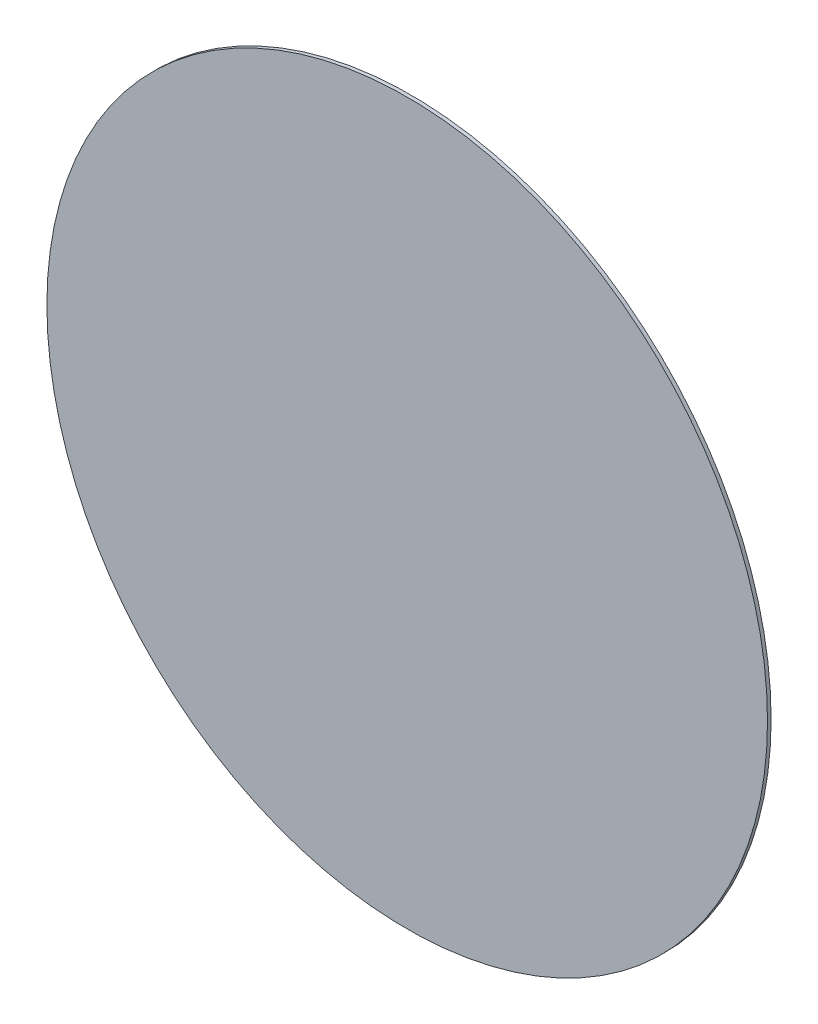
ISO-10303-21;
HEADER;
FILE_DESCRIPTION(('STEP AP214'),'2;1');
FILE_NAME('part.step','',(''),(''),'','','');
FILE_SCHEMA(('AUTOMOTIVE_DESIGN { 1 0 10303 214 1 1 1 1 }'));
ENDSEC;
DATA;
#1=APPLICATION_CONTEXT('core data for automotive mechanical design processes');
#2=APPLICATION_PROTOCOL_DEFINITION('international standard','automotive_design',2000,#1);
#3=PRODUCT_CONTEXT('',#1,'mechanical');
#4=PRODUCT('Part','Part','',(#3));
#5=PRODUCT_RELATED_PRODUCT_CATEGORY('part','',(#4));
#6=PRODUCT_DEFINITION_FORMATION('','',#4);
#7=PRODUCT_DEFINITION_CONTEXT('part definition',#1,'design');
#8=PRODUCT_DEFINITION('design','',#6,#7);
#9=PRODUCT_DEFINITION_SHAPE('','',#8);
#10=(LENGTH_UNIT() NAMED_UNIT(*) SI_UNIT(.MILLI.,.METRE.));
#11=(NAMED_UNIT(*) PLANE_ANGLE_UNIT() SI_UNIT($,.RADIAN.));
#12=(NAMED_UNIT(*) SI_UNIT($,.STERADIAN.) SOLID_ANGLE_UNIT());
#13=UNCERTAINTY_MEASURE_WITH_UNIT(LENGTH_MEASURE(1.E-05),#10,'distance_accuracy_value','');
#14=(GEOMETRIC_REPRESENTATION_CONTEXT(3) GLOBAL_UNCERTAINTY_ASSIGNED_CONTEXT((#13)) GLOBAL_UNIT_ASSIGNED_CONTEXT((#10,
#11,#12)) REPRESENTATION_CONTEXT('',''));
#15=CARTESIAN_POINT('',(0.,0.,0.));
#16=DIRECTION('',(0.,0.,1.));
#17=DIRECTION('',(1.,0.,0.));
#18=AXIS2_PLACEMENT_3D('',#15,#16,#17);
#19=CARTESIAN_POINT('',(0.,0.,0.0635));
#20=DIRECTION('',(0.,0.,-1.));
#21=DIRECTION('',(-1.,0.,0.));
#22=AXIS2_PLACEMENT_3D('',#19,#20,#21);
#23=CYLINDRICAL_SURFACE('',#22,6.35);
#24=CARTESIAN_POINT('',(0.,0.,0.0635));
#25=DIRECTION('',(0.,0.,1.));
#26=DIRECTION('',(1.,0.,0.));
#27=AXIS2_PLACEMENT_3D('',#24,#25,#26);
#28=CIRCLE('',#27,6.35);
#29=CARTESIAN_POINT('',(6.35,0.,0.0635));
#30=VERTEX_POINT('',#29);
#31=EDGE_CURVE('E10',#30,#30,#28,.T.);
#32=ORIENTED_EDGE('',*,*,#31,.F.);
#33=EDGE_LOOP('',(#32));
#34=FACE_BOUND('',#33,.T.);
#35=CARTESIAN_POINT('',(0.,0.,0.));
#36=DIRECTION('',(0.,0.,1.));
#37=DIRECTION('',(1.,0.,0.));
#38=AXIS2_PLACEMENT_3D('',#35,#36,#37);
#39=CIRCLE('',#38,6.35);
#40=CARTESIAN_POINT('',(6.35,0.,0.));
#41=VERTEX_POINT('',#40);
#42=EDGE_CURVE('E46',#41,#41,#39,.T.);
#43=ORIENTED_EDGE('',*,*,#42,.T.);
#44=EDGE_LOOP('',(#43));
#45=FACE_BOUND('',#44,.T.);
#46=ADVANCED_FACE('F43',(#34,#45),#23,.T.);
#47=CARTESIAN_POINT('',(0.,0.,0.0635));
#48=DIRECTION('',(0.,0.,1.));
#49=DIRECTION('',(1.,0.,0.));
#50=AXIS2_PLACEMENT_3D('',#47,#48,#49);
#51=PLANE('',#50);
#52=ORIENTED_EDGE('',*,*,#31,.T.);
#53=EDGE_LOOP('',(#52));
#54=FACE_BOUND('',#53,.T.);
#55=ADVANCED_FACE('F62',(#54),#51,.T.);
#56=CARTESIAN_POINT('',(0.,0.,0.));
#57=DIRECTION('',(0.,0.,1.));
#58=DIRECTION('',(1.,0.,0.));
#59=AXIS2_PLACEMENT_3D('',#56,#57,#58);
#60=PLANE('',#59);
#61=ORIENTED_EDGE('',*,*,#42,.F.);
#62=EDGE_LOOP('',(#61));
#63=FACE_BOUND('',#62,.T.);
#64=ADVANCED_FACE('F60',(#63),#60,.F.);
#65=CLOSED_SHELL('',(#46,#55,#64));
#66=MANIFOLD_SOLID_BREP('B2',#65);
#67=ADVANCED_BREP_SHAPE_REPRESENTATION('',(#18,#66),#14);
#68=SHAPE_DEFINITION_REPRESENTATION(#9,#67);
ENDSEC;
END-ISO-10303-21;
